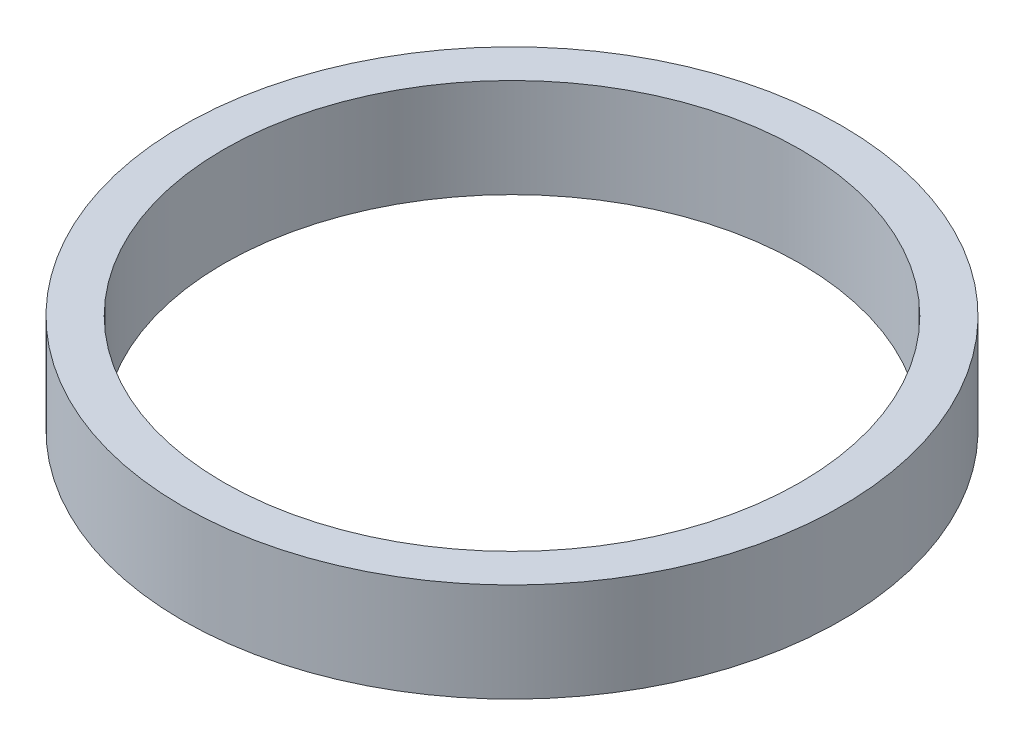
ISO-10303-21;
HEADER;
FILE_DESCRIPTION(('STEP AP214'),'2;1');
FILE_NAME('part.step','',(''),(''),'','','');
FILE_SCHEMA(('AUTOMOTIVE_DESIGN { 1 0 10303 214 1 1 1 1 }'));
ENDSEC;
DATA;
#1=APPLICATION_CONTEXT('core data for automotive mechanical design processes');
#2=APPLICATION_PROTOCOL_DEFINITION('international standard','automotive_design',2000,#1);
#3=PRODUCT_CONTEXT('',#1,'mechanical');
#4=PRODUCT('Part','Part','',(#3));
#5=PRODUCT_RELATED_PRODUCT_CATEGORY('part','',(#4));
#6=PRODUCT_DEFINITION_FORMATION('','',#4);
#7=PRODUCT_DEFINITION_CONTEXT('part definition',#1,'design');
#8=PRODUCT_DEFINITION('design','',#6,#7);
#9=PRODUCT_DEFINITION_SHAPE('','',#8);
#10=(LENGTH_UNIT() NAMED_UNIT(*) SI_UNIT(.MILLI.,.METRE.));
#11=(NAMED_UNIT(*) PLANE_ANGLE_UNIT() SI_UNIT($,.RADIAN.));
#12=(NAMED_UNIT(*) SI_UNIT($,.STERADIAN.) SOLID_ANGLE_UNIT());
#13=UNCERTAINTY_MEASURE_WITH_UNIT(LENGTH_MEASURE(1.E-05),#10,'distance_accuracy_value','');
#14=(GEOMETRIC_REPRESENTATION_CONTEXT(3) GLOBAL_UNCERTAINTY_ASSIGNED_CONTEXT((#13)) GLOBAL_UNIT_ASSIGNED_CONTEXT((#10,
#11,#12)) REPRESENTATION_CONTEXT('',''));
#15=CARTESIAN_POINT('',(0.,0.,0.));
#16=DIRECTION('',(0.,0.,1.));
#17=DIRECTION('',(1.,0.,0.));
#18=AXIS2_PLACEMENT_3D('',#15,#16,#17);
#19=CARTESIAN_POINT('',(0.,3.,0.));
#20=DIRECTION('',(0.,1.,0.));
#21=DIRECTION('',(0.,0.,1.));
#22=AXIS2_PLACEMENT_3D('',#19,#20,#21);
#23=PLANE('',#22);
#24=CARTESIAN_POINT('',(0.,3.,0.));
#25=DIRECTION('',(0.,1.,0.));
#26=DIRECTION('',(0.,0.,1.));
#27=AXIS2_PLACEMENT_3D('',#24,#25,#26);
#28=CIRCLE('',#27,10.);
#29=CARTESIAN_POINT('',(0.,3.,10.));
#30=VERTEX_POINT('',#29);
#31=EDGE_CURVE('E10',#30,#30,#28,.T.);
#32=ORIENTED_EDGE('',*,*,#31,.T.);
#33=EDGE_LOOP('',(#32));
#34=FACE_BOUND('',#33,.T.);
#35=CARTESIAN_POINT('',(0.,3.,0.));
#36=DIRECTION('',(0.,1.,0.));
#37=DIRECTION('',(0.,0.,1.));
#38=AXIS2_PLACEMENT_3D('',#35,#36,#37);
#39=CIRCLE('',#38,8.75);
#40=CARTESIAN_POINT('',(0.,3.,8.75));
#41=VERTEX_POINT('',#40);
#42=EDGE_CURVE('E43',#41,#41,#39,.T.);
#43=ORIENTED_EDGE('',*,*,#42,.F.);
#44=EDGE_LOOP('',(#43));
#45=FACE_BOUND('',#44,.T.);
#46=ADVANCED_FACE('F32',(#34,#45),#23,.T.);
#47=CARTESIAN_POINT('',(0.,0.,0.));
#48=DIRECTION('',(0.,1.,0.));
#49=DIRECTION('',(0.,0.,1.));
#50=AXIS2_PLACEMENT_3D('',#47,#48,#49);
#51=PLANE('',#50);
#52=CARTESIAN_POINT('',(0.,0.,0.));
#53=DIRECTION('',(0.,1.,0.));
#54=DIRECTION('',(0.,0.,1.));
#55=AXIS2_PLACEMENT_3D('',#52,#53,#54);
#56=CIRCLE('',#55,10.);
#57=CARTESIAN_POINT('',(0.,0.,10.));
#58=VERTEX_POINT('',#57);
#59=EDGE_CURVE('E36',#58,#58,#56,.T.);
#60=ORIENTED_EDGE('',*,*,#59,.F.);
#61=EDGE_LOOP('',(#60));
#62=FACE_BOUND('',#61,.T.);
#63=CARTESIAN_POINT('',(0.,0.,0.));
#64=DIRECTION('',(0.,1.,0.));
#65=DIRECTION('',(0.,0.,1.));
#66=AXIS2_PLACEMENT_3D('',#63,#64,#65);
#67=CIRCLE('',#66,8.75);
#68=CARTESIAN_POINT('',(0.,0.,8.75));
#69=VERTEX_POINT('',#68);
#70=EDGE_CURVE('E45',#69,#69,#67,.T.);
#71=ORIENTED_EDGE('',*,*,#70,.T.);
#72=EDGE_LOOP('',(#71));
#73=FACE_BOUND('',#72,.T.);
#74=ADVANCED_FACE('F55',(#62,#73),#51,.F.);
#75=CARTESIAN_POINT('',(0.,3.,0.));
#76=DIRECTION('',(0.,-1.,0.));
#77=DIRECTION('',(0.,0.,-1.));
#78=AXIS2_PLACEMENT_3D('',#75,#76,#77);
#79=CYLINDRICAL_SURFACE('',#78,10.);
#80=ORIENTED_EDGE('',*,*,#31,.F.);
#81=EDGE_LOOP('',(#80));
#82=FACE_BOUND('',#81,.T.);
#83=ORIENTED_EDGE('',*,*,#59,.T.);
#84=EDGE_LOOP('',(#83));
#85=FACE_BOUND('',#84,.T.);
#86=ADVANCED_FACE('F34',(#82,#85),#79,.T.);
#87=CARTESIAN_POINT('',(0.,3.,0.));
#88=DIRECTION('',(0.,-1.,0.));
#89=DIRECTION('',(0.,0.,-1.));
#90=AXIS2_PLACEMENT_3D('',#87,#88,#89);
#91=CYLINDRICAL_SURFACE('',#90,8.75);
#92=ORIENTED_EDGE('',*,*,#42,.T.);
#93=EDGE_LOOP('',(#92));
#94=FACE_BOUND('',#93,.T.);
#95=ORIENTED_EDGE('',*,*,#70,.F.);
#96=EDGE_LOOP('',(#95));
#97=FACE_BOUND('',#96,.T.);
#98=ADVANCED_FACE('F51',(#94,#97),#91,.F.);
#99=CLOSED_SHELL('',(#46,#74,#86,#98));
#100=MANIFOLD_SOLID_BREP('B2',#99);
#101=ADVANCED_BREP_SHAPE_REPRESENTATION('',(#18,#100),#14);
#102=SHAPE_DEFINITION_REPRESENTATION(#9,#101);
ENDSEC;
END-ISO-10303-21;
